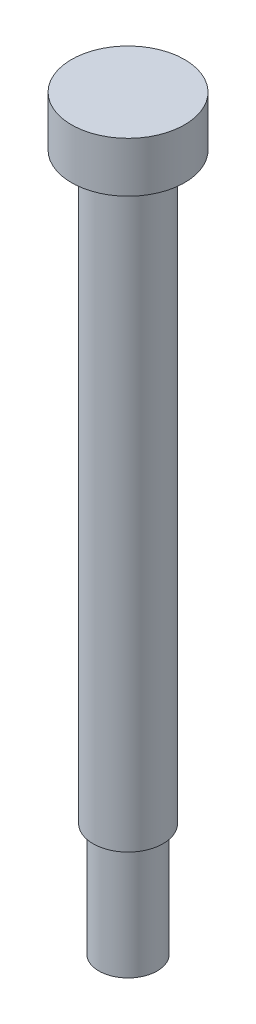
ISO-10303-21;
HEADER;
FILE_DESCRIPTION(('STEP AP214'),'2;1');
FILE_NAME('part.step','',(''),(''),'','','');
FILE_SCHEMA(('AUTOMOTIVE_DESIGN { 1 0 10303 214 1 1 1 1 }'));
ENDSEC;
DATA;
#1=APPLICATION_CONTEXT('core data for automotive mechanical design processes');
#2=APPLICATION_PROTOCOL_DEFINITION('international standard','automotive_design',2000,#1);
#3=PRODUCT_CONTEXT('',#1,'mechanical');
#4=PRODUCT('Part','Part','',(#3));
#5=PRODUCT_RELATED_PRODUCT_CATEGORY('part','',(#4));
#6=PRODUCT_DEFINITION_FORMATION('','',#4);
#7=PRODUCT_DEFINITION_CONTEXT('part definition',#1,'design');
#8=PRODUCT_DEFINITION('design','',#6,#7);
#9=PRODUCT_DEFINITION_SHAPE('','',#8);
#10=(LENGTH_UNIT() NAMED_UNIT(*) SI_UNIT(.MILLI.,.METRE.));
#11=(NAMED_UNIT(*) PLANE_ANGLE_UNIT() SI_UNIT($,.RADIAN.));
#12=(NAMED_UNIT(*) SI_UNIT($,.STERADIAN.) SOLID_ANGLE_UNIT());
#13=UNCERTAINTY_MEASURE_WITH_UNIT(LENGTH_MEASURE(1.E-05),#10,'distance_accuracy_value','');
#14=(GEOMETRIC_REPRESENTATION_CONTEXT(3) GLOBAL_UNCERTAINTY_ASSIGNED_CONTEXT((#13)) GLOBAL_UNIT_ASSIGNED_CONTEXT((#10,
#11,#12)) REPRESENTATION_CONTEXT('',''));
#15=CARTESIAN_POINT('',(0.,0.,0.));
#16=DIRECTION('',(0.,0.,1.));
#17=DIRECTION('',(1.,0.,0.));
#18=AXIS2_PLACEMENT_3D('',#15,#16,#17);
#19=CARTESIAN_POINT('',(0.,4.3,0.));
#20=DIRECTION('',(0.,-1.,0.));
#21=DIRECTION('',(0.,0.,-1.));
#22=AXIS2_PLACEMENT_3D('',#19,#20,#21);
#23=CYLINDRICAL_SURFACE('',#22,4.85);
#24=CARTESIAN_POINT('',(0.,4.3,0.));
#25=DIRECTION('',(0.,1.,0.));
#26=DIRECTION('',(0.,0.,1.));
#27=AXIS2_PLACEMENT_3D('',#24,#25,#26);
#28=CIRCLE('',#27,4.85);
#29=CARTESIAN_POINT('',(0.,4.3,-4.85));
#30=VERTEX_POINT('',#29);
#31=EDGE_CURVE('E54',#30,#30,#28,.T.);
#32=CARTESIAN_POINT('',(0.,0.,0.));
#33=DIRECTION('',(0.,1.,0.));
#34=DIRECTION('',(0.,0.,1.));
#35=AXIS2_PLACEMENT_3D('',#32,#33,#34);
#36=CIRCLE('',#35,4.85);
#37=CARTESIAN_POINT('',(0.,0.,-4.85));
#38=VERTEX_POINT('',#37);
#39=EDGE_CURVE('E46',#38,#38,#36,.T.);
#40=CARTESIAN_POINT('',(0.,4.3,-4.85));
#41=CARTESIAN_POINT('',(0.,4.25520833333333,-4.85));
#42=CARTESIAN_POINT('',(0.,4.21041666666667,-4.85));
#43=CARTESIAN_POINT('',(0.,4.12083333333333,-4.85));
#44=CARTESIAN_POINT('',(0.,4.07604166666667,-4.85));
#45=CARTESIAN_POINT('',(0.,3.98645833333333,-4.85));
#46=CARTESIAN_POINT('',(0.,3.94166666666667,-4.85));
#47=CARTESIAN_POINT('',(0.,3.85208333333333,-4.85));
#48=CARTESIAN_POINT('',(0.,3.80729166666667,-4.85));
#49=CARTESIAN_POINT('',(0.,3.71770833333333,-4.85));
#50=CARTESIAN_POINT('',(0.,3.67291666666667,-4.85));
#51=CARTESIAN_POINT('',(0.,3.58333333333333,-4.85));
#52=CARTESIAN_POINT('',(0.,3.53854166666667,-4.85));
#53=CARTESIAN_POINT('',(0.,3.44895833333333,-4.85));
#54=CARTESIAN_POINT('',(0.,3.40416666666667,-4.85));
#55=CARTESIAN_POINT('',(0.,3.31458333333333,-4.85));
#56=CARTESIAN_POINT('',(0.,3.26979166666667,-4.85));
#57=CARTESIAN_POINT('',(0.,3.18020833333333,-4.85));
#58=CARTESIAN_POINT('',(0.,3.13541666666667,-4.85));
#59=CARTESIAN_POINT('',(0.,3.04583333333333,-4.85));
#60=CARTESIAN_POINT('',(0.,3.00104166666667,-4.85));
#61=CARTESIAN_POINT('',(0.,2.91145833333333,-4.85));
#62=CARTESIAN_POINT('',(0.,2.86666666666667,-4.85));
#63=CARTESIAN_POINT('',(0.,2.77708333333333,-4.85));
#64=CARTESIAN_POINT('',(0.,2.73229166666667,-4.85));
#65=CARTESIAN_POINT('',(0.,2.64270833333333,-4.85));
#66=CARTESIAN_POINT('',(0.,2.59791666666667,-4.85));
#67=CARTESIAN_POINT('',(0.,2.50833333333333,-4.85));
#68=CARTESIAN_POINT('',(0.,2.46354166666667,-4.85));
#69=CARTESIAN_POINT('',(0.,2.37395833333333,-4.85));
#70=CARTESIAN_POINT('',(0.,2.32916666666667,-4.85));
#71=CARTESIAN_POINT('',(0.,2.23958333333333,-4.85));
#72=CARTESIAN_POINT('',(0.,2.19479166666667,-4.85));
#73=CARTESIAN_POINT('',(0.,2.10520833333333,-4.85));
#74=CARTESIAN_POINT('',(0.,2.06041666666667,-4.85));
#75=CARTESIAN_POINT('',(0.,1.97083333333333,-4.85));
#76=CARTESIAN_POINT('',(0.,1.92604166666667,-4.85));
#77=CARTESIAN_POINT('',(0.,1.83645833333333,-4.85));
#78=CARTESIAN_POINT('',(0.,1.79166666666667,-4.85));
#79=CARTESIAN_POINT('',(0.,1.70208333333333,-4.85));
#80=CARTESIAN_POINT('',(0.,1.65729166666667,-4.85));
#81=CARTESIAN_POINT('',(0.,1.56770833333333,-4.85));
#82=CARTESIAN_POINT('',(0.,1.52291666666667,-4.85));
#83=CARTESIAN_POINT('',(0.,1.43333333333333,-4.85));
#84=CARTESIAN_POINT('',(0.,1.38854166666667,-4.85));
#85=CARTESIAN_POINT('',(0.,1.29895833333333,-4.85));
#86=CARTESIAN_POINT('',(0.,1.25416666666667,-4.85));
#87=CARTESIAN_POINT('',(0.,1.16458333333333,-4.85));
#88=CARTESIAN_POINT('',(0.,1.11979166666667,-4.85));
#89=CARTESIAN_POINT('',(0.,1.03020833333333,-4.85));
#90=CARTESIAN_POINT('',(0.,0.985416666666666,-4.85));
#91=CARTESIAN_POINT('',(0.,0.895833333333333,-4.85));
#92=CARTESIAN_POINT('',(0.,0.851041666666666,-4.85));
#93=CARTESIAN_POINT('',(0.,0.761458333333333,-4.85));
#94=CARTESIAN_POINT('',(0.,0.716666666666666,-4.85));
#95=CARTESIAN_POINT('',(0.,0.627083333333333,-4.85));
#96=CARTESIAN_POINT('',(0.,0.582291666666666,-4.85));
#97=CARTESIAN_POINT('',(0.,0.492708333333333,-4.85));
#98=CARTESIAN_POINT('',(0.,0.447916666666666,-4.85));
#99=CARTESIAN_POINT('',(0.,0.358333333333333,-4.85));
#100=CARTESIAN_POINT('',(0.,0.313541666666666,-4.85));
#101=CARTESIAN_POINT('',(0.,0.223958333333332,-4.85));
#102=CARTESIAN_POINT('',(0.,0.179166666666666,-4.85));
#103=CARTESIAN_POINT('',(0.,0.0895833333333324,-4.85));
#104=CARTESIAN_POINT('',(0.,0.0447916666666658,-4.85));
#105=CARTESIAN_POINT('',(0.,0.,-4.85));
#106=B_SPLINE_CURVE_WITH_KNOTS('',3,(#40,#41,#42,#43,#44,#45,#46,#47,#48,#49,#50,#51,#52,#53,
#54,#55,#56,#57,#58,#59,#60,#61,#62,#63,#64,#65,#66,#67,#68,#69,#70,#71,#72,#73,#74,#75,#76,#77,
#78,#79,#80,#81,#82,#83,#84,#85,#86,#87,#88,#89,#90,#91,#92,#93,#94,#95,#96,#97,#98,#99,#100,
#101,#102,#103,#104,#105),.UNSPECIFIED.,.F.,.F.,(4,2,2,2,2,2,2,2,2,2,2,2,2,2,2,2,2,2,2,2,2,2,2,
2,2,2,2,2,2,2,2,2,4),(0.,0.134375,0.26875,0.403124999999999,0.5375,0.671875,0.80625,0.940625,
1.075,1.209375,1.34375,1.478125,1.6125,1.746875,1.88125,2.015625,2.15,2.284375,2.41875,2.553125,
2.6875,2.821875,2.95625,3.090625,3.225,3.359375,3.49375,3.628125,3.7625,3.896875,4.03125,
4.165625,4.3),.UNSPECIFIED.);
#107=EDGE_CURVE('BSEAM43',#30,#38,#106,.T.);
#108=ORIENTED_EDGE('',*,*,#31,.F.);
#109=ORIENTED_EDGE('',*,*,#39,.T.);
#110=ORIENTED_EDGE('',*,*,#107,.T.);
#111=ORIENTED_EDGE('',*,*,#107,.F.);
#112=EDGE_LOOP('',(#108,#110,#109,#111));
#113=FACE_BOUND('',#112,.T.);
#114=ADVANCED_FACE('F43',(#113),#23,.T.);
#115=CARTESIAN_POINT('',(0.,4.3,0.));
#116=DIRECTION('',(0.,1.,0.));
#117=DIRECTION('',(0.,0.,1.));
#118=AXIS2_PLACEMENT_3D('',#115,#116,#117);
#119=PLANE('',#118);
#120=ORIENTED_EDGE('',*,*,#31,.T.);
#121=EDGE_LOOP('',(#120));
#122=FACE_BOUND('',#121,.T.);
#123=ADVANCED_FACE('F75',(#122),#119,.T.);
#124=CARTESIAN_POINT('',(0.,0.,0.));
#125=DIRECTION('',(0.,1.,0.));
#126=DIRECTION('',(0.,0.,1.));
#127=AXIS2_PLACEMENT_3D('',#124,#125,#126);
#128=PLANE('',#127);
#129=CARTESIAN_POINT('',(0.,0.,0.));
#130=DIRECTION('',(0.,-1.,0.));
#131=DIRECTION('',(0.,0.,-1.));
#132=AXIS2_PLACEMENT_3D('',#129,#130,#131);
#133=CIRCLE('',#132,3.);
#134=CARTESIAN_POINT('',(0.,0.,-3.));
#135=VERTEX_POINT('',#134);
#136=EDGE_CURVE('E49',#135,#135,#133,.T.);
#137=ORIENTED_EDGE('',*,*,#136,.F.);
#138=EDGE_LOOP('',(#137));
#139=FACE_BOUND('',#138,.T.);
#140=ORIENTED_EDGE('',*,*,#39,.F.);
#141=EDGE_LOOP('',(#140));
#142=FACE_BOUND('',#141,.T.);
#143=ADVANCED_FACE('F68',(#139,#142),#128,.F.);
#144=CARTESIAN_POINT('',(0.,-50.,0.));
#145=DIRECTION('',(0.,1.,0.));
#146=DIRECTION('',(0.,0.,1.));
#147=AXIS2_PLACEMENT_3D('',#144,#145,#146);
#148=CYLINDRICAL_SURFACE('',#147,3.);
#149=CARTESIAN_POINT('',(0.,-50.,0.));
#150=DIRECTION('',(0.,-1.,0.));
#151=DIRECTION('',(0.,0.,-1.));
#152=AXIS2_PLACEMENT_3D('',#149,#150,#151);
#153=CIRCLE('',#152,3.);
#154=CARTESIAN_POINT('',(0.,-50.,-3.));
#155=VERTEX_POINT('',#154);
#156=EDGE_CURVE('E58',#155,#155,#153,.T.);
#157=ORIENTED_EDGE('',*,*,#156,.F.);
#158=EDGE_LOOP('',(#157));
#159=FACE_BOUND('',#158,.T.);
#160=ORIENTED_EDGE('',*,*,#136,.T.);
#161=EDGE_LOOP('',(#160));
#162=FACE_BOUND('',#161,.T.);
#163=ADVANCED_FACE('F72',(#159,#162),#148,.T.);
#164=CARTESIAN_POINT('',(0.,-50.,0.));
#165=DIRECTION('',(0.,-1.,0.));
#166=DIRECTION('',(0.,0.,-1.));
#167=AXIS2_PLACEMENT_3D('',#164,#165,#166);
#168=PLANE('',#167);
#169=CARTESIAN_POINT('',(0.,-50.,0.));
#170=DIRECTION('',(0.,-1.,0.));
#171=DIRECTION('',(0.,0.,-1.));
#172=AXIS2_PLACEMENT_3D('',#169,#170,#171);
#173=CIRCLE('',#172,2.5);
#174=CARTESIAN_POINT('',(0.,-50.,-2.5));
#175=VERTEX_POINT('',#174);
#176=EDGE_CURVE('E10',#175,#175,#173,.T.);
#177=ORIENTED_EDGE('',*,*,#176,.F.);
#178=EDGE_LOOP('',(#177));
#179=FACE_BOUND('',#178,.T.);
#180=ORIENTED_EDGE('',*,*,#156,.T.);
#181=EDGE_LOOP('',(#180));
#182=FACE_BOUND('',#181,.T.);
#183=ADVANCED_FACE('F76',(#179,#182),#168,.T.);
#184=CARTESIAN_POINT('',(0.,-59.7,0.));
#185=DIRECTION('',(0.,1.,0.));
#186=DIRECTION('',(0.,0.,1.));
#187=AXIS2_PLACEMENT_3D('',#184,#185,#186);
#188=CYLINDRICAL_SURFACE('',#187,2.5);
#189=CARTESIAN_POINT('',(0.,-59.7,0.));
#190=DIRECTION('',(0.,-1.,0.));
#191=DIRECTION('',(0.,0.,-1.));
#192=AXIS2_PLACEMENT_3D('',#189,#190,#191);
#193=CIRCLE('',#192,2.5);
#194=CARTESIAN_POINT('',(0.,-59.7,-2.5));
#195=VERTEX_POINT('',#194);
#196=EDGE_CURVE('E56',#195,#195,#193,.T.);
#197=ORIENTED_EDGE('',*,*,#196,.F.);
#198=EDGE_LOOP('',(#197));
#199=FACE_BOUND('',#198,.T.);
#200=ORIENTED_EDGE('',*,*,#176,.T.);
#201=EDGE_LOOP('',(#200));
#202=FACE_BOUND('',#201,.T.);
#203=ADVANCED_FACE('F110',(#199,#202),#188,.T.);
#204=CARTESIAN_POINT('',(0.,-59.7,0.));
#205=DIRECTION('',(0.,-1.,0.));
#206=DIRECTION('',(0.,0.,-1.));
#207=AXIS2_PLACEMENT_3D('',#204,#205,#206);
#208=PLANE('',#207);
#209=ORIENTED_EDGE('',*,*,#196,.T.);
#210=EDGE_LOOP('',(#209));
#211=FACE_BOUND('',#210,.T.);
#212=ADVANCED_FACE('F116',(#211),#208,.T.);
#213=CLOSED_SHELL('',(#114,#123,#143,#163,#183,#203,#212));
#214=MANIFOLD_SOLID_BREP('B2',#213);
#215=ADVANCED_BREP_SHAPE_REPRESENTATION('',(#18,#214),#14);
#216=SHAPE_DEFINITION_REPRESENTATION(#9,#215);
ENDSEC;
END-ISO-10303-21;
